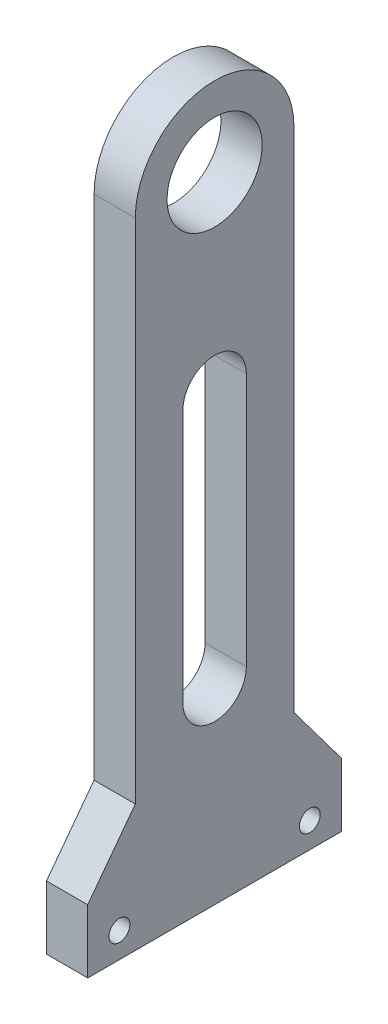
ISO-10303-21;
HEADER;
FILE_DESCRIPTION(('STEP AP214'),'2;1');
FILE_NAME('part.step','',(''),(''),'','','');
FILE_SCHEMA(('AUTOMOTIVE_DESIGN { 1 0 10303 214 1 1 1 1 }'));
ENDSEC;
DATA;
#1=APPLICATION_CONTEXT('core data for automotive mechanical design processes');
#2=APPLICATION_PROTOCOL_DEFINITION('international standard','automotive_design',2000,#1);
#3=PRODUCT_CONTEXT('',#1,'mechanical');
#4=PRODUCT('Part','Part','',(#3));
#5=PRODUCT_RELATED_PRODUCT_CATEGORY('part','',(#4));
#6=PRODUCT_DEFINITION_FORMATION('','',#4);
#7=PRODUCT_DEFINITION_CONTEXT('part definition',#1,'design');
#8=PRODUCT_DEFINITION('design','',#6,#7);
#9=PRODUCT_DEFINITION_SHAPE('','',#8);
#10=(LENGTH_UNIT() NAMED_UNIT(*) SI_UNIT(.MILLI.,.METRE.));
#11=(NAMED_UNIT(*) PLANE_ANGLE_UNIT() SI_UNIT($,.RADIAN.));
#12=(NAMED_UNIT(*) SI_UNIT($,.STERADIAN.) SOLID_ANGLE_UNIT());
#13=UNCERTAINTY_MEASURE_WITH_UNIT(LENGTH_MEASURE(1.E-05),#10,'distance_accuracy_value','');
#14=(GEOMETRIC_REPRESENTATION_CONTEXT(3) GLOBAL_UNCERTAINTY_ASSIGNED_CONTEXT((#13)) GLOBAL_UNIT_ASSIGNED_CONTEXT((#10,
#11,#12)) REPRESENTATION_CONTEXT('',''));
#15=CARTESIAN_POINT('',(0.,0.,0.));
#16=DIRECTION('',(0.,0.,1.));
#17=DIRECTION('',(1.,0.,0.));
#18=AXIS2_PLACEMENT_3D('',#15,#16,#17);
#19=CARTESIAN_POINT('',(0.,0.,0.));
#20=DIRECTION('',(1.,0.,0.));
#21=DIRECTION('',(0.,0.,-1.));
#22=AXIS2_PLACEMENT_3D('',#19,#20,#21);
#23=PLANE('',#22);
#24=DIRECTION('',(0.,-0.799999999999999,0.600000000000001));
#25=VECTOR('',#24,1.);
#26=CARTESIAN_POINT('',(0.,-90.,20.));
#27=LINE('',#26,#25);
#28=CARTESIAN_POINT('',(0.,-80.0000000000001,12.5));
#29=VERTEX_POINT('',#28);
#30=CARTESIAN_POINT('',(0.,-90.,20.));
#31=VERTEX_POINT('',#30);
#32=EDGE_CURVE('E133',#29,#31,#27,.T.);
#33=ORIENTED_EDGE('',*,*,#32,.F.);
#34=DIRECTION('',(0.,1.,0.));
#35=VECTOR('',#34,1.);
#36=CARTESIAN_POINT('',(0.,-90.,12.5));
#37=LINE('',#36,#35);
#38=CARTESIAN_POINT('',(0.,0.,12.5));
#39=VERTEX_POINT('',#38);
#40=EDGE_CURVE('E139',#29,#39,#37,.T.);
#41=ORIENTED_EDGE('',*,*,#40,.T.);
#42=CARTESIAN_POINT('',(0.,0.,0.));
#43=DIRECTION('',(-1.,0.,0.));
#44=DIRECTION('',(0.,0.,1.));
#45=AXIS2_PLACEMENT_3D('',#42,#43,#44);
#46=CIRCLE('',#45,12.5);
#47=CARTESIAN_POINT('',(0.,0.,-12.5));
#48=VERTEX_POINT('',#47);
#49=EDGE_CURVE('E190',#48,#39,#46,.F.);
#50=ORIENTED_EDGE('',*,*,#49,.F.);
#51=DIRECTION('',(0.,1.,0.));
#52=VECTOR('',#51,1.);
#53=CARTESIAN_POINT('',(0.,-90.,-12.5));
#54=LINE('',#53,#52);
#55=CARTESIAN_POINT('',(0.,-80.0000000000001,-12.5));
#56=VERTEX_POINT('',#55);
#57=EDGE_CURVE('E145',#48,#56,#54,.F.);
#58=ORIENTED_EDGE('',*,*,#57,.T.);
#59=DIRECTION('',(0.,0.799999999999999,0.600000000000001));
#60=VECTOR('',#59,1.);
#61=CARTESIAN_POINT('',(0.,-80.0000000000001,-12.5));
#62=LINE('',#61,#60);
#63=CARTESIAN_POINT('',(0.,-90.,-20.));
#64=VERTEX_POINT('',#63);
#65=EDGE_CURVE('E148',#64,#56,#62,.T.);
#66=ORIENTED_EDGE('',*,*,#65,.F.);
#67=DIRECTION('',(0.,1.,0.));
#68=VECTOR('',#67,1.);
#69=CARTESIAN_POINT('',(0.,-100.,-20.));
#70=LINE('',#69,#68);
#71=CARTESIAN_POINT('',(0.,-100.,-20.));
#72=VERTEX_POINT('',#71);
#73=EDGE_CURVE('E156',#64,#72,#70,.F.);
#74=ORIENTED_EDGE('',*,*,#73,.T.);
#75=DIRECTION('',(0.,0.,1.));
#76=VECTOR('',#75,1.);
#77=CARTESIAN_POINT('',(0.,-100.,20.));
#78=LINE('',#77,#76);
#79=CARTESIAN_POINT('',(0.,-100.,20.));
#80=VERTEX_POINT('',#79);
#81=EDGE_CURVE('E162',#72,#80,#78,.T.);
#82=ORIENTED_EDGE('',*,*,#81,.T.);
#83=DIRECTION('',(0.,1.,0.));
#84=VECTOR('',#83,1.);
#85=CARTESIAN_POINT('',(0.,-100.,20.));
#86=LINE('',#85,#84);
#87=EDGE_CURVE('E127',#80,#31,#86,.T.);
#88=ORIENTED_EDGE('',*,*,#87,.T.);
#89=EDGE_LOOP('',(#33,#41,#50,#58,#66,#74,#82,#88));
#90=FACE_BOUND('',#89,.T.);
#91=CARTESIAN_POINT('',(0.,0.,0.));
#92=DIRECTION('',(-1.,0.,0.));
#93=DIRECTION('',(0.,0.,1.));
#94=AXIS2_PLACEMENT_3D('',#91,#92,#93);
#95=CIRCLE('',#94,7.5);
#96=CARTESIAN_POINT('',(0.,0.,7.5));
#97=VERTEX_POINT('',#96);
#98=EDGE_CURVE('E130',#97,#97,#95,.F.);
#99=ORIENTED_EDGE('',*,*,#98,.T.);
#100=EDGE_LOOP('',(#99));
#101=FACE_BOUND('',#100,.T.);
#102=CARTESIAN_POINT('',(0.,-96.,15.));
#103=DIRECTION('',(-1.,0.,0.));
#104=DIRECTION('',(0.,0.,1.));
#105=AXIS2_PLACEMENT_3D('',#102,#103,#104);
#106=CIRCLE('',#105,1.64999999999999);
#107=CARTESIAN_POINT('',(0.,-96.,16.65));
#108=VERTEX_POINT('',#107);
#109=EDGE_CURVE('E195',#108,#108,#106,.F.);
#110=ORIENTED_EDGE('',*,*,#109,.T.);
#111=EDGE_LOOP('',(#110));
#112=FACE_BOUND('',#111,.T.);
#113=CARTESIAN_POINT('',(0.,-96.,-15.));
#114=DIRECTION('',(-1.,0.,0.));
#115=DIRECTION('',(0.,0.,1.));
#116=AXIS2_PLACEMENT_3D('',#113,#114,#115);
#117=CIRCLE('',#116,1.64999999999999);
#118=CARTESIAN_POINT('',(0.,-96.,-13.35));
#119=VERTEX_POINT('',#118);
#120=EDGE_CURVE('E198',#119,#119,#117,.F.);
#121=ORIENTED_EDGE('',*,*,#120,.T.);
#122=EDGE_LOOP('',(#121));
#123=FACE_BOUND('',#122,.T.);
#124=CARTESIAN_POINT('',(0.,-30.,0.));
#125=DIRECTION('',(-1.,0.,0.));
#126=DIRECTION('',(0.,0.,1.));
#127=AXIS2_PLACEMENT_3D('',#124,#125,#126);
#128=CIRCLE('',#127,5.);
#129=CARTESIAN_POINT('',(0.,-30.,-5.));
#130=VERTEX_POINT('',#129);
#131=CARTESIAN_POINT('',(0.,-30.,5.));
#132=VERTEX_POINT('',#131);
#133=EDGE_CURVE('E20',#130,#132,#128,.F.);
#134=ORIENTED_EDGE('',*,*,#133,.T.);
#135=DIRECTION('',(0.,1.,0.));
#136=VECTOR('',#135,1.);
#137=CARTESIAN_POINT('',(0.,-30.,5.));
#138=LINE('',#137,#136);
#139=CARTESIAN_POINT('',(0.,-70.,5.00000000000001));
#140=VERTEX_POINT('',#139);
#141=EDGE_CURVE('E167',#140,#132,#138,.T.);
#142=ORIENTED_EDGE('',*,*,#141,.F.);
#143=CARTESIAN_POINT('',(0.,-70.,0.));
#144=DIRECTION('',(-1.,0.,0.));
#145=DIRECTION('',(0.,0.,1.));
#146=AXIS2_PLACEMENT_3D('',#143,#144,#145);
#147=CIRCLE('',#146,5.);
#148=CARTESIAN_POINT('',(0.,-70.,-4.99999999999999));
#149=VERTEX_POINT('',#148);
#150=EDGE_CURVE('E106',#140,#149,#147,.F.);
#151=ORIENTED_EDGE('',*,*,#150,.T.);
#152=DIRECTION('',(0.,1.,0.));
#153=VECTOR('',#152,1.);
#154=CARTESIAN_POINT('',(0.,-30.,-5.));
#155=LINE('',#154,#153);
#156=EDGE_CURVE('E102',#149,#130,#155,.T.);
#157=ORIENTED_EDGE('',*,*,#156,.T.);
#158=EDGE_LOOP('',(#134,#142,#151,#157));
#159=FACE_BOUND('',#158,.T.);
#160=ADVANCED_FACE('F17',(#90,#101,#112,#123,#159),#23,.F.);
#161=CARTESIAN_POINT('',(28.,-30.,0.));
#162=DIRECTION('',(-1.,0.,0.));
#163=DIRECTION('',(0.,0.,1.));
#164=AXIS2_PLACEMENT_3D('',#161,#162,#163);
#165=CYLINDRICAL_SURFACE('',#164,5.);
#166=DIRECTION('',(1.,0.,0.));
#167=VECTOR('',#166,1.);
#168=CARTESIAN_POINT('',(28.,-30.,5.));
#169=LINE('',#168,#167);
#170=CARTESIAN_POINT('',(6.5,-30.,5.));
#171=VERTEX_POINT('',#170);
#172=EDGE_CURVE('E116',#132,#171,#169,.T.);
#173=ORIENTED_EDGE('',*,*,#172,.F.);
#174=ORIENTED_EDGE('',*,*,#133,.F.);
#175=DIRECTION('',(1.,0.,0.));
#176=VECTOR('',#175,1.);
#177=CARTESIAN_POINT('',(28.,-30.,-5.));
#178=LINE('',#177,#176);
#179=CARTESIAN_POINT('',(6.5,-30.,-5.));
#180=VERTEX_POINT('',#179);
#181=EDGE_CURVE('E110',#130,#180,#178,.T.);
#182=ORIENTED_EDGE('',*,*,#181,.T.);
#183=CARTESIAN_POINT('',(6.5,-30.,0.));
#184=DIRECTION('',(-1.,0.,0.));
#185=DIRECTION('',(0.,0.,1.));
#186=AXIS2_PLACEMENT_3D('',#183,#184,#185);
#187=CIRCLE('',#186,5.);
#188=EDGE_CURVE('E188',#171,#180,#187,.T.);
#189=ORIENTED_EDGE('',*,*,#188,.F.);
#190=EDGE_LOOP('',(#173,#174,#182,#189));
#191=FACE_BOUND('',#190,.T.);
#192=ADVANCED_FACE('F113',(#191),#165,.F.);
#193=CARTESIAN_POINT('',(28.,-30.,-5.));
#194=DIRECTION('',(0.,0.,-1.));
#195=DIRECTION('',(0.,1.,0.));
#196=AXIS2_PLACEMENT_3D('',#193,#194,#195);
#197=PLANE('',#196);
#198=ORIENTED_EDGE('',*,*,#181,.F.);
#199=ORIENTED_EDGE('',*,*,#156,.F.);
#200=DIRECTION('',(-1.,0.,0.));
#201=VECTOR('',#200,1.);
#202=CARTESIAN_POINT('',(28.,-70.,-4.99999999999999));
#203=LINE('',#202,#201);
#204=CARTESIAN_POINT('',(6.5,-70.,-5.));
#205=VERTEX_POINT('',#204);
#206=EDGE_CURVE('E123',#149,#205,#203,.F.);
#207=ORIENTED_EDGE('',*,*,#206,.T.);
#208=DIRECTION('',(0.,1.,0.));
#209=VECTOR('',#208,1.);
#210=CARTESIAN_POINT('',(6.5,0.,-5.));
#211=LINE('',#210,#209);
#212=EDGE_CURVE('E120',#180,#205,#211,.F.);
#213=ORIENTED_EDGE('',*,*,#212,.F.);
#214=EDGE_LOOP('',(#198,#199,#207,#213));
#215=FACE_BOUND('',#214,.T.);
#216=ADVANCED_FACE('F118',(#215),#197,.F.);
#217=CARTESIAN_POINT('',(28.,-70.,0.));
#218=DIRECTION('',(-1.,0.,0.));
#219=DIRECTION('',(0.,0.,1.));
#220=AXIS2_PLACEMENT_3D('',#217,#218,#219);
#221=CYLINDRICAL_SURFACE('',#220,5.);
#222=ORIENTED_EDGE('',*,*,#206,.F.);
#223=ORIENTED_EDGE('',*,*,#150,.F.);
#224=DIRECTION('',(1.,0.,0.));
#225=VECTOR('',#224,1.);
#226=CARTESIAN_POINT('',(28.,-70.,5.00000000000001));
#227=LINE('',#226,#225);
#228=CARTESIAN_POINT('',(6.5,-70.,5.00000000000001));
#229=VERTEX_POINT('',#228);
#230=EDGE_CURVE('E168',#229,#140,#227,.F.);
#231=ORIENTED_EDGE('',*,*,#230,.F.);
#232=CARTESIAN_POINT('',(6.5,-70.,0.));
#233=DIRECTION('',(-1.,0.,0.));
#234=DIRECTION('',(0.,0.,1.));
#235=AXIS2_PLACEMENT_3D('',#232,#233,#234);
#236=CIRCLE('',#235,5.);
#237=EDGE_CURVE('E185',#205,#229,#236,.T.);
#238=ORIENTED_EDGE('',*,*,#237,.F.);
#239=EDGE_LOOP('',(#222,#223,#231,#238));
#240=FACE_BOUND('',#239,.T.);
#241=ADVANCED_FACE('F408',(#240),#221,.F.);
#242=CARTESIAN_POINT('',(28.,-30.,5.));
#243=DIRECTION('',(0.,0.,-1.));
#244=DIRECTION('',(0.,1.,0.));
#245=AXIS2_PLACEMENT_3D('',#242,#243,#244);
#246=PLANE('',#245);
#247=ORIENTED_EDGE('',*,*,#172,.T.);
#248=DIRECTION('',(0.,1.,0.));
#249=VECTOR('',#248,1.);
#250=CARTESIAN_POINT('',(6.5,0.,5.00000000000001));
#251=LINE('',#250,#249);
#252=EDGE_CURVE('E184',#229,#171,#251,.T.);
#253=ORIENTED_EDGE('',*,*,#252,.F.);
#254=ORIENTED_EDGE('',*,*,#230,.T.);
#255=ORIENTED_EDGE('',*,*,#141,.T.);
#256=EDGE_LOOP('',(#247,#253,#254,#255));
#257=FACE_BOUND('',#256,.T.);
#258=ADVANCED_FACE('F398',(#257),#246,.T.);
#259=CARTESIAN_POINT('',(0.,-96.,-15.));
#260=DIRECTION('',(-1.,0.,0.));
#261=DIRECTION('',(0.,0.,1.));
#262=AXIS2_PLACEMENT_3D('',#259,#260,#261);
#263=CYLINDRICAL_SURFACE('',#262,1.64999999999999);
#264=ORIENTED_EDGE('',*,*,#120,.F.);
#265=EDGE_LOOP('',(#264));
#266=FACE_BOUND('',#265,.T.);
#267=CARTESIAN_POINT('',(6.5,-96.,-15.));
#268=DIRECTION('',(-1.,0.,0.));
#269=DIRECTION('',(0.,0.,1.));
#270=AXIS2_PLACEMENT_3D('',#267,#268,#269);
#271=CIRCLE('',#270,1.64999999999999);
#272=CARTESIAN_POINT('',(6.5,-96.,-13.35));
#273=VERTEX_POINT('',#272);
#274=EDGE_CURVE('E181',#273,#273,#271,.T.);
#275=ORIENTED_EDGE('',*,*,#274,.F.);
#276=EDGE_LOOP('',(#275));
#277=FACE_BOUND('',#276,.T.);
#278=ADVANCED_FACE('F388',(#266,#277),#263,.F.);
#279=CARTESIAN_POINT('',(0.,-96.,15.));
#280=DIRECTION('',(-1.,0.,0.));
#281=DIRECTION('',(0.,0.,1.));
#282=AXIS2_PLACEMENT_3D('',#279,#280,#281);
#283=CYLINDRICAL_SURFACE('',#282,1.64999999999999);
#284=ORIENTED_EDGE('',*,*,#109,.F.);
#285=EDGE_LOOP('',(#284));
#286=FACE_BOUND('',#285,.T.);
#287=CARTESIAN_POINT('',(6.5,-96.,15.));
#288=DIRECTION('',(-1.,0.,0.));
#289=DIRECTION('',(0.,0.,1.));
#290=AXIS2_PLACEMENT_3D('',#287,#288,#289);
#291=CIRCLE('',#290,1.64999999999999);
#292=CARTESIAN_POINT('',(6.5,-96.,16.65));
#293=VERTEX_POINT('',#292);
#294=EDGE_CURVE('E178',#293,#293,#291,.T.);
#295=ORIENTED_EDGE('',*,*,#294,.F.);
#296=EDGE_LOOP('',(#295));
#297=FACE_BOUND('',#296,.T.);
#298=ADVANCED_FACE('F378',(#286,#297),#283,.F.);
#299=CARTESIAN_POINT('',(15.,0.,0.));
#300=DIRECTION('',(-1.,0.,0.));
#301=DIRECTION('',(0.,0.,1.));
#302=AXIS2_PLACEMENT_3D('',#299,#300,#301);
#303=CYLINDRICAL_SURFACE('',#302,7.5);
#304=CARTESIAN_POINT('',(6.5,0.,0.));
#305=DIRECTION('',(-1.,0.,0.));
#306=DIRECTION('',(0.,0.,1.));
#307=AXIS2_PLACEMENT_3D('',#304,#305,#306);
#308=CIRCLE('',#307,7.5);
#309=CARTESIAN_POINT('',(6.5,0.,7.5));
#310=VERTEX_POINT('',#309);
#311=EDGE_CURVE('E174',#310,#310,#308,.T.);
#312=ORIENTED_EDGE('',*,*,#311,.F.);
#313=EDGE_LOOP('',(#312));
#314=FACE_BOUND('',#313,.T.);
#315=ORIENTED_EDGE('',*,*,#98,.F.);
#316=EDGE_LOOP('',(#315));
#317=FACE_BOUND('',#316,.T.);
#318=ADVANCED_FACE('F370',(#314,#317),#303,.F.);
#319=CARTESIAN_POINT('',(6.5,-100.,20.));
#320=DIRECTION('',(0.,0.,-1.));
#321=DIRECTION('',(-1.,0.,0.));
#322=AXIS2_PLACEMENT_3D('',#319,#320,#321);
#323=PLANE('',#322);
#324=DIRECTION('',(1.,0.,0.));
#325=VECTOR('',#324,1.);
#326=CARTESIAN_POINT('',(6.5,-100.,20.));
#327=LINE('',#326,#325);
#328=CARTESIAN_POINT('',(6.5,-100.,20.));
#329=VERTEX_POINT('',#328);
#330=EDGE_CURVE('E129',#80,#329,#327,.T.);
#331=ORIENTED_EDGE('',*,*,#330,.T.);
#332=DIRECTION('',(0.,1.,0.));
#333=VECTOR('',#332,1.);
#334=CARTESIAN_POINT('',(6.5,0.,20.));
#335=LINE('',#334,#333);
#336=CARTESIAN_POINT('',(6.5,-90.,20.));
#337=VERTEX_POINT('',#336);
#338=EDGE_CURVE('E177',#337,#329,#335,.F.);
#339=ORIENTED_EDGE('',*,*,#338,.F.);
#340=DIRECTION('',(1.,0.,0.));
#341=VECTOR('',#340,1.);
#342=CARTESIAN_POINT('',(6.5,-90.,20.));
#343=LINE('',#342,#341);
#344=EDGE_CURVE('E136',#31,#337,#343,.T.);
#345=ORIENTED_EDGE('',*,*,#344,.F.);
#346=ORIENTED_EDGE('',*,*,#87,.F.);
#347=EDGE_LOOP('',(#331,#339,#345,#346));
#348=FACE_BOUND('',#347,.T.);
#349=ADVANCED_FACE('F278',(#348),#323,.F.);
#350=CARTESIAN_POINT('',(6.5,-100.,20.));
#351=DIRECTION('',(0.,1.,0.));
#352=DIRECTION('',(0.,0.,1.));
#353=AXIS2_PLACEMENT_3D('',#350,#351,#352);
#354=PLANE('',#353);
#355=DIRECTION('',(1.,0.,0.));
#356=VECTOR('',#355,1.);
#357=CARTESIAN_POINT('',(6.5,-100.,-20.));
#358=LINE('',#357,#356);
#359=CARTESIAN_POINT('',(6.5,-100.,-20.));
#360=VERTEX_POINT('',#359);
#361=EDGE_CURVE('E159',#72,#360,#358,.T.);
#362=ORIENTED_EDGE('',*,*,#361,.T.);
#363=DIRECTION('',(0.,0.,-1.));
#364=VECTOR('',#363,1.);
#365=CARTESIAN_POINT('',(6.5,-100.,0.));
#366=LINE('',#365,#364);
#367=EDGE_CURVE('E216',#329,#360,#366,.T.);
#368=ORIENTED_EDGE('',*,*,#367,.F.);
#369=ORIENTED_EDGE('',*,*,#330,.F.);
#370=ORIENTED_EDGE('',*,*,#81,.F.);
#371=EDGE_LOOP('',(#362,#368,#369,#370));
#372=FACE_BOUND('',#371,.T.);
#373=ADVANCED_FACE('F283',(#372),#354,.F.);
#374=CARTESIAN_POINT('',(6.5,-100.,-20.));
#375=DIRECTION('',(0.,0.,1.));
#376=DIRECTION('',(1.,0.,0.));
#377=AXIS2_PLACEMENT_3D('',#374,#375,#376);
#378=PLANE('',#377);
#379=DIRECTION('',(1.,0.,0.));
#380=VECTOR('',#379,1.);
#381=CARTESIAN_POINT('',(6.5,-90.,-20.));
#382=LINE('',#381,#380);
#383=CARTESIAN_POINT('',(6.5,-90.,-20.));
#384=VERTEX_POINT('',#383);
#385=EDGE_CURVE('E153',#384,#64,#382,.F.);
#386=ORIENTED_EDGE('',*,*,#385,.F.);
#387=DIRECTION('',(0.,1.,0.));
#388=VECTOR('',#387,1.);
#389=CARTESIAN_POINT('',(6.5,0.,-20.));
#390=LINE('',#389,#388);
#391=EDGE_CURVE('E224',#360,#384,#390,.T.);
#392=ORIENTED_EDGE('',*,*,#391,.F.);
#393=ORIENTED_EDGE('',*,*,#361,.F.);
#394=ORIENTED_EDGE('',*,*,#73,.F.);
#395=EDGE_LOOP('',(#386,#392,#393,#394));
#396=FACE_BOUND('',#395,.T.);
#397=ADVANCED_FACE('F286',(#396),#378,.F.);
#398=CARTESIAN_POINT('',(6.5,-80.0000000000001,-12.5));
#399=DIRECTION('',(0.,0.600000000000001,-0.799999999999999));
#400=DIRECTION('',(0.,0.799999999999999,0.600000000000001));
#401=AXIS2_PLACEMENT_3D('',#398,#399,#400);
#402=PLANE('',#401);
#403=ORIENTED_EDGE('',*,*,#65,.T.);
#404=DIRECTION('',(1.,0.,0.));
#405=VECTOR('',#404,1.);
#406=CARTESIAN_POINT('',(6.5,-80.0000000000001,-12.5));
#407=LINE('',#406,#405);
#408=CARTESIAN_POINT('',(6.5,-80.0000000000001,-12.5));
#409=VERTEX_POINT('',#408);
#410=EDGE_CURVE('E147',#56,#409,#407,.T.);
#411=ORIENTED_EDGE('',*,*,#410,.T.);
#412=DIRECTION('',(0.,0.799999999999998,0.600000000000003));
#413=VECTOR('',#412,1.);
#414=CARTESIAN_POINT('',(6.5,-90.,-20.));
#415=LINE('',#414,#413);
#416=EDGE_CURVE('E232',#384,#409,#415,.T.);
#417=ORIENTED_EDGE('',*,*,#416,.F.);
#418=ORIENTED_EDGE('',*,*,#385,.T.);
#419=EDGE_LOOP('',(#403,#411,#417,#418));
#420=FACE_BOUND('',#419,.T.);
#421=ADVANCED_FACE('F290',(#420),#402,.T.);
#422=CARTESIAN_POINT('',(6.5,-90.,-12.5));
#423=DIRECTION('',(0.,0.,1.));
#424=DIRECTION('',(1.,0.,0.));
#425=AXIS2_PLACEMENT_3D('',#422,#423,#424);
#426=PLANE('',#425);
#427=ORIENTED_EDGE('',*,*,#410,.F.);
#428=ORIENTED_EDGE('',*,*,#57,.F.);
#429=DIRECTION('',(-1.,0.,0.));
#430=VECTOR('',#429,1.);
#431=CARTESIAN_POINT('',(6.5,0.,-12.5));
#432=LINE('',#431,#430);
#433=CARTESIAN_POINT('',(6.5,0.,-12.5));
#434=VERTEX_POINT('',#433);
#435=EDGE_CURVE('E192',#434,#48,#432,.T.);
#436=ORIENTED_EDGE('',*,*,#435,.F.);
#437=DIRECTION('',(0.,1.,0.));
#438=VECTOR('',#437,1.);
#439=CARTESIAN_POINT('',(6.5,0.,-12.5));
#440=LINE('',#439,#438);
#441=EDGE_CURVE('E173',#409,#434,#440,.T.);
#442=ORIENTED_EDGE('',*,*,#441,.F.);
#443=EDGE_LOOP('',(#427,#428,#436,#442));
#444=FACE_BOUND('',#443,.T.);
#445=ADVANCED_FACE('F294',(#444),#426,.F.);
#446=CARTESIAN_POINT('',(6.5,0.,0.));
#447=DIRECTION('',(-1.,0.,0.));
#448=DIRECTION('',(0.,0.,1.));
#449=AXIS2_PLACEMENT_3D('',#446,#447,#448);
#450=CYLINDRICAL_SURFACE('',#449,12.5);
#451=CARTESIAN_POINT('',(6.5,0.,0.));
#452=DIRECTION('',(-1.,0.,0.));
#453=DIRECTION('',(0.,0.,1.));
#454=AXIS2_PLACEMENT_3D('',#451,#452,#453);
#455=CIRCLE('',#454,12.5);
#456=CARTESIAN_POINT('',(6.5,0.,12.5));
#457=VERTEX_POINT('',#456);
#458=EDGE_CURVE('E170',#434,#457,#455,.F.);
#459=ORIENTED_EDGE('',*,*,#458,.F.);
#460=ORIENTED_EDGE('',*,*,#435,.T.);
#461=ORIENTED_EDGE('',*,*,#49,.T.);
#462=DIRECTION('',(1.,0.,0.));
#463=VECTOR('',#462,1.);
#464=CARTESIAN_POINT('',(6.5,0.,12.5));
#465=LINE('',#464,#463);
#466=EDGE_CURVE('E142',#39,#457,#465,.T.);
#467=ORIENTED_EDGE('',*,*,#466,.T.);
#468=EDGE_LOOP('',(#459,#460,#461,#467));
#469=FACE_BOUND('',#468,.T.);
#470=ADVANCED_FACE('F269',(#469),#450,.T.);
#471=CARTESIAN_POINT('',(6.5,-90.,12.5));
#472=DIRECTION('',(0.,0.,-1.));
#473=DIRECTION('',(0.,1.,0.));
#474=AXIS2_PLACEMENT_3D('',#471,#472,#473);
#475=PLANE('',#474);
#476=DIRECTION('',(1.,0.,0.));
#477=VECTOR('',#476,1.);
#478=CARTESIAN_POINT('',(6.5,-80.0000000000001,12.5));
#479=LINE('',#478,#477);
#480=CARTESIAN_POINT('',(6.5,-80.0000000000001,12.5));
#481=VERTEX_POINT('',#480);
#482=EDGE_CURVE('E35',#481,#29,#479,.F.);
#483=ORIENTED_EDGE('',*,*,#482,.F.);
#484=DIRECTION('',(0.,1.,0.));
#485=VECTOR('',#484,1.);
#486=CARTESIAN_POINT('',(6.5,0.,12.5));
#487=LINE('',#486,#485);
#488=EDGE_CURVE('E26',#457,#481,#487,.F.);
#489=ORIENTED_EDGE('',*,*,#488,.F.);
#490=ORIENTED_EDGE('',*,*,#466,.F.);
#491=ORIENTED_EDGE('',*,*,#40,.F.);
#492=EDGE_LOOP('',(#483,#489,#490,#491));
#493=FACE_BOUND('',#492,.T.);
#494=ADVANCED_FACE('F266',(#493),#475,.F.);
#495=CARTESIAN_POINT('',(6.5,-90.,20.));
#496=DIRECTION('',(0.,0.600000000000001,0.799999999999999));
#497=DIRECTION('',(0.,-0.799999999999999,0.600000000000001));
#498=AXIS2_PLACEMENT_3D('',#495,#496,#497);
#499=PLANE('',#498);
#500=ORIENTED_EDGE('',*,*,#32,.T.);
#501=ORIENTED_EDGE('',*,*,#344,.T.);
#502=DIRECTION('',(0.,-0.799999999999998,0.600000000000002));
#503=VECTOR('',#502,1.);
#504=CARTESIAN_POINT('',(6.5,-80.0000000000001,12.5));
#505=LINE('',#504,#503);
#506=EDGE_CURVE('E11',#481,#337,#505,.T.);
#507=ORIENTED_EDGE('',*,*,#506,.F.);
#508=ORIENTED_EDGE('',*,*,#482,.T.);
#509=EDGE_LOOP('',(#500,#501,#507,#508));
#510=FACE_BOUND('',#509,.T.);
#511=ADVANCED_FACE('F275',(#510),#499,.T.);
#512=CARTESIAN_POINT('',(6.5,0.,0.));
#513=DIRECTION('',(1.,0.,0.));
#514=DIRECTION('',(0.,0.,-1.));
#515=AXIS2_PLACEMENT_3D('',#512,#513,#514);
#516=PLANE('',#515);
#517=ORIENTED_EDGE('',*,*,#488,.T.);
#518=ORIENTED_EDGE('',*,*,#506,.T.);
#519=ORIENTED_EDGE('',*,*,#338,.T.);
#520=ORIENTED_EDGE('',*,*,#367,.T.);
#521=ORIENTED_EDGE('',*,*,#391,.T.);
#522=ORIENTED_EDGE('',*,*,#416,.T.);
#523=ORIENTED_EDGE('',*,*,#441,.T.);
#524=ORIENTED_EDGE('',*,*,#458,.T.);
#525=EDGE_LOOP('',(#517,#518,#519,#520,#521,#522,#523,#524));
#526=FACE_BOUND('',#525,.T.);
#527=ORIENTED_EDGE('',*,*,#311,.T.);
#528=EDGE_LOOP('',(#527));
#529=FACE_BOUND('',#528,.T.);
#530=ORIENTED_EDGE('',*,*,#294,.T.);
#531=EDGE_LOOP('',(#530));
#532=FACE_BOUND('',#531,.T.);
#533=ORIENTED_EDGE('',*,*,#274,.T.);
#534=EDGE_LOOP('',(#533));
#535=FACE_BOUND('',#534,.T.);
#536=ORIENTED_EDGE('',*,*,#237,.T.);
#537=ORIENTED_EDGE('',*,*,#252,.T.);
#538=ORIENTED_EDGE('',*,*,#188,.T.);
#539=ORIENTED_EDGE('',*,*,#212,.T.);
#540=EDGE_LOOP('',(#536,#537,#538,#539));
#541=FACE_BOUND('',#540,.T.);
#542=ADVANCED_FACE('F262',(#526,#529,#532,#535,#541),#516,.T.);
#543=CLOSED_SHELL('',(#160,#192,#216,#241,#258,#278,#298,#318,#349,#373,#397,#421,#445,#470,
#494,#511,#542));
#544=MANIFOLD_SOLID_BREP('B1',#543);
#545=ADVANCED_BREP_SHAPE_REPRESENTATION('',(#18,#544),#14);
#546=SHAPE_DEFINITION_REPRESENTATION(#9,#545);
ENDSEC;
END-ISO-10303-21;
